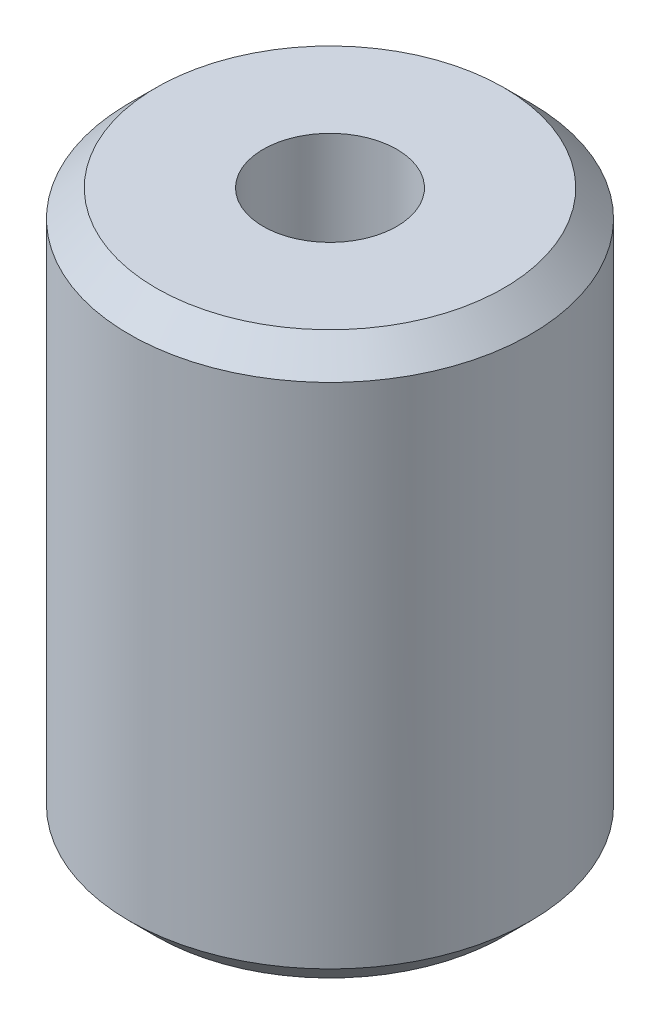
ISO-10303-21;
HEADER;
FILE_DESCRIPTION(('STEP AP214'),'2;1');
FILE_NAME('part.step','',(''),(''),'','','');
FILE_SCHEMA(('AUTOMOTIVE_DESIGN { 1 0 10303 214 1 1 1 1 }'));
ENDSEC;
DATA;
#1=APPLICATION_CONTEXT('core data for automotive mechanical design processes');
#2=APPLICATION_PROTOCOL_DEFINITION('international standard','automotive_design',2000,#1);
#3=PRODUCT_CONTEXT('',#1,'mechanical');
#4=PRODUCT('Part','Part','',(#3));
#5=PRODUCT_RELATED_PRODUCT_CATEGORY('part','',(#4));
#6=PRODUCT_DEFINITION_FORMATION('','',#4);
#7=PRODUCT_DEFINITION_CONTEXT('part definition',#1,'design');
#8=PRODUCT_DEFINITION('design','',#6,#7);
#9=PRODUCT_DEFINITION_SHAPE('','',#8);
#10=(LENGTH_UNIT() NAMED_UNIT(*) SI_UNIT(.MILLI.,.METRE.));
#11=(NAMED_UNIT(*) PLANE_ANGLE_UNIT() SI_UNIT($,.RADIAN.));
#12=(NAMED_UNIT(*) SI_UNIT($,.STERADIAN.) SOLID_ANGLE_UNIT());
#13=UNCERTAINTY_MEASURE_WITH_UNIT(LENGTH_MEASURE(1.E-05),#10,'distance_accuracy_value','');
#14=(GEOMETRIC_REPRESENTATION_CONTEXT(3) GLOBAL_UNCERTAINTY_ASSIGNED_CONTEXT((#13)) GLOBAL_UNIT_ASSIGNED_CONTEXT((#10,
#11,#12)) REPRESENTATION_CONTEXT('',''));
#15=CARTESIAN_POINT('',(0.,0.,0.));
#16=DIRECTION('',(0.,0.,1.));
#17=DIRECTION('',(1.,0.,0.));
#18=AXIS2_PLACEMENT_3D('',#15,#16,#17);
#19=CARTESIAN_POINT('',(0.,10.5,0.));
#20=DIRECTION('',(0.,1.,0.));
#21=DIRECTION('',(0.,0.,1.));
#22=AXIS2_PLACEMENT_3D('',#19,#20,#21);
#23=PLANE('',#22);
#24=CARTESIAN_POINT('',(0.,10.5,0.));
#25=DIRECTION('',(0.,1.,0.));
#26=DIRECTION('',(0.,0.,1.));
#27=AXIS2_PLACEMENT_3D('',#24,#25,#26);
#28=CIRCLE('',#27,6.50000000000002);
#29=CARTESIAN_POINT('',(0.,10.5,6.50000000000002));
#30=VERTEX_POINT('',#29);
#31=EDGE_CURVE('E10',#30,#30,#28,.T.);
#32=ORIENTED_EDGE('',*,*,#31,.T.);
#33=EDGE_LOOP('',(#32));
#34=FACE_BOUND('',#33,.T.);
#35=CARTESIAN_POINT('',(0.,10.5,0.));
#36=DIRECTION('',(0.,1.,0.));
#37=DIRECTION('',(0.,0.,1.));
#38=AXIS2_PLACEMENT_3D('',#35,#36,#37);
#39=CIRCLE('',#38,2.5);
#40=CARTESIAN_POINT('',(0.,10.5,-2.5));
#41=VERTEX_POINT('',#40);
#42=EDGE_CURVE('E60',#41,#41,#39,.T.);
#43=ORIENTED_EDGE('',*,*,#42,.F.);
#44=EDGE_LOOP('',(#43));
#45=FACE_BOUND('',#44,.T.);
#46=ADVANCED_FACE('F39',(#34,#45),#23,.T.);
#47=CARTESIAN_POINT('',(0.,-10.5,0.));
#48=DIRECTION('',(0.,1.,0.));
#49=DIRECTION('',(0.,0.,1.));
#50=AXIS2_PLACEMENT_3D('',#47,#48,#49);
#51=PLANE('',#50);
#52=CARTESIAN_POINT('',(0.,-10.5,0.));
#53=DIRECTION('',(0.,1.,0.));
#54=DIRECTION('',(0.,0.,1.));
#55=AXIS2_PLACEMENT_3D('',#52,#53,#54);
#56=CIRCLE('',#55,6.49999999999997);
#57=CARTESIAN_POINT('',(0.,-10.5,6.49999999999997));
#58=VERTEX_POINT('',#57);
#59=EDGE_CURVE('E47',#58,#58,#56,.F.);
#60=ORIENTED_EDGE('',*,*,#59,.T.);
#61=EDGE_LOOP('',(#60));
#62=FACE_BOUND('',#61,.T.);
#63=CARTESIAN_POINT('',(0.,-10.5,0.));
#64=DIRECTION('',(0.,1.,0.));
#65=DIRECTION('',(0.,0.,1.));
#66=AXIS2_PLACEMENT_3D('',#63,#64,#65);
#67=CIRCLE('',#66,2.5);
#68=CARTESIAN_POINT('',(0.,-10.5,-2.5));
#69=VERTEX_POINT('',#68);
#70=EDGE_CURVE('E61',#69,#69,#67,.T.);
#71=ORIENTED_EDGE('',*,*,#70,.T.);
#72=EDGE_LOOP('',(#71));
#73=FACE_BOUND('',#72,.T.);
#74=ADVANCED_FACE('F71',(#62,#73),#51,.F.);
#75=CARTESIAN_POINT('',(0.,10.5,0.));
#76=DIRECTION('',(0.,-1.,0.));
#77=DIRECTION('',(0.,0.,-1.));
#78=AXIS2_PLACEMENT_3D('',#75,#76,#77);
#79=CYLINDRICAL_SURFACE('',#78,7.5);
#80=CARTESIAN_POINT('',(0.,-9.49999999999998,0.));
#81=DIRECTION('',(0.,1.,0.));
#82=DIRECTION('',(0.,0.,1.));
#83=AXIS2_PLACEMENT_3D('',#80,#81,#82);
#84=CIRCLE('',#83,7.5);
#85=CARTESIAN_POINT('',(0.,-9.49999999999998,-7.5));
#86=VERTEX_POINT('',#85);
#87=EDGE_CURVE('E51',#86,#86,#84,.T.);
#88=CARTESIAN_POINT('',(0.,9.50000000000001,0.));
#89=DIRECTION('',(0.,1.,0.));
#90=DIRECTION('',(0.,0.,1.));
#91=AXIS2_PLACEMENT_3D('',#88,#89,#90);
#92=CIRCLE('',#91,7.5);
#93=CARTESIAN_POINT('',(0.,9.50000000000001,-7.5));
#94=VERTEX_POINT('',#93);
#95=EDGE_CURVE('E55',#94,#94,#92,.F.);
#96=CARTESIAN_POINT('',(0.,-9.49999999999998,-7.5));
#97=CARTESIAN_POINT('',(0.,-9.30208333333331,-7.5));
#98=CARTESIAN_POINT('',(0.,-9.10416666666665,-7.5));
#99=CARTESIAN_POINT('',(0.,-8.70833333333331,-7.5));
#100=CARTESIAN_POINT('',(0.,-8.51041666666664,-7.5));
#101=CARTESIAN_POINT('',(0.,-8.11458333333331,-7.5));
#102=CARTESIAN_POINT('',(0.,-7.91666666666665,-7.5));
#103=CARTESIAN_POINT('',(0.,-7.52083333333331,-7.5));
#104=CARTESIAN_POINT('',(0.,-7.32291666666665,-7.5));
#105=CARTESIAN_POINT('',(0.,-6.92708333333331,-7.5));
#106=CARTESIAN_POINT('',(0.,-6.72916666666665,-7.5));
#107=CARTESIAN_POINT('',(0.,-6.33333333333331,-7.5));
#108=CARTESIAN_POINT('',(0.,-6.13541666666665,-7.5));
#109=CARTESIAN_POINT('',(0.,-5.73958333333331,-7.5));
#110=CARTESIAN_POINT('',(0.,-5.54166666666665,-7.5));
#111=CARTESIAN_POINT('',(0.,-5.14583333333331,-7.5));
#112=CARTESIAN_POINT('',(0.,-4.94791666666665,-7.5));
#113=CARTESIAN_POINT('',(0.,-4.55208333333332,-7.5));
#114=CARTESIAN_POINT('',(0.,-4.35416666666665,-7.5));
#115=CARTESIAN_POINT('',(0.,-3.95833333333332,-7.5));
#116=CARTESIAN_POINT('',(0.,-3.76041666666665,-7.5));
#117=CARTESIAN_POINT('',(0.,-3.36458333333332,-7.5));
#118=CARTESIAN_POINT('',(0.,-3.16666666666665,-7.5));
#119=CARTESIAN_POINT('',(0.,-2.77083333333331,-7.5));
#120=CARTESIAN_POINT('',(0.,-2.57291666666665,-7.5));
#121=CARTESIAN_POINT('',(0.,-2.17708333333332,-7.5));
#122=CARTESIAN_POINT('',(0.,-1.97916666666665,-7.5));
#123=CARTESIAN_POINT('',(0.,-1.58333333333332,-7.5));
#124=CARTESIAN_POINT('',(0.,-1.38541666666665,-7.5));
#125=CARTESIAN_POINT('',(0.,-0.989583333333316,-7.5));
#126=CARTESIAN_POINT('',(0.,-0.791666666666649,-7.5));
#127=CARTESIAN_POINT('',(0.,-0.395833333333316,-7.5));
#128=CARTESIAN_POINT('',(0.,-0.197916666666649,-7.5));
#129=CARTESIAN_POINT('',(0.,0.197916666666684,-7.5));
#130=CARTESIAN_POINT('',(0.,0.395833333333351,-7.5));
#131=CARTESIAN_POINT('',(0.,0.791666666666684,-7.5));
#132=CARTESIAN_POINT('',(0.,0.98958333333335,-7.5));
#133=CARTESIAN_POINT('',(0.,1.38541666666668,-7.5));
#134=CARTESIAN_POINT('',(0.,1.58333333333335,-7.5));
#135=CARTESIAN_POINT('',(0.,1.97916666666668,-7.5));
#136=CARTESIAN_POINT('',(0.,2.17708333333335,-7.5));
#137=CARTESIAN_POINT('',(0.,2.57291666666668,-7.5));
#138=CARTESIAN_POINT('',(0.,2.77083333333335,-7.5));
#139=CARTESIAN_POINT('',(0.,3.16666666666668,-7.5));
#140=CARTESIAN_POINT('',(0.,3.36458333333335,-7.5));
#141=CARTESIAN_POINT('',(0.,3.76041666666668,-7.5));
#142=CARTESIAN_POINT('',(0.,3.95833333333335,-7.5));
#143=CARTESIAN_POINT('',(0.,4.35416666666668,-7.5));
#144=CARTESIAN_POINT('',(0.,4.55208333333335,-7.5));
#145=CARTESIAN_POINT('',(0.,4.94791666666668,-7.5));
#146=CARTESIAN_POINT('',(0.,5.14583333333335,-7.5));
#147=CARTESIAN_POINT('',(0.,5.54166666666668,-7.5));
#148=CARTESIAN_POINT('',(0.,5.73958333333335,-7.5));
#149=CARTESIAN_POINT('',(0.,6.13541666666668,-7.5));
#150=CARTESIAN_POINT('',(0.,6.33333333333335,-7.5));
#151=CARTESIAN_POINT('',(0.,6.72916666666668,-7.5));
#152=CARTESIAN_POINT('',(0.,6.92708333333335,-7.5));
#153=CARTESIAN_POINT('',(0.,7.32291666666668,-7.5));
#154=CARTESIAN_POINT('',(0.,7.52083333333335,-7.5));
#155=CARTESIAN_POINT('',(0.,7.91666666666668,-7.5));
#156=CARTESIAN_POINT('',(0.,8.11458333333335,-7.5));
#157=CARTESIAN_POINT('',(0.,8.51041666666668,-7.5));
#158=CARTESIAN_POINT('',(0.,8.70833333333335,-7.5));
#159=CARTESIAN_POINT('',(0.,9.10416666666668,-7.5));
#160=CARTESIAN_POINT('',(0.,9.30208333333335,-7.5));
#161=CARTESIAN_POINT('',(0.,9.50000000000001,-7.5));
#162=B_SPLINE_CURVE_WITH_KNOTS('',3,(#96,#97,#98,#99,#100,#101,#102,#103,#104,#105,#106,#107,
#108,#109,#110,#111,#112,#113,#114,#115,#116,#117,#118,#119,#120,#121,#122,#123,#124,#125,#126,
#127,#128,#129,#130,#131,#132,#133,#134,#135,#136,#137,#138,#139,#140,#141,#142,#143,#144,#145,
#146,#147,#148,#149,#150,#151,#152,#153,#154,#155,#156,#157,#158,#159,#160,#161),.UNSPECIFIED.,
.F.,.F.,(4,2,2,2,2,2,2,2,2,2,2,2,2,2,2,2,2,2,2,2,2,2,2,2,2,2,2,2,2,2,2,2,4),(0.,
0.593750000000001,1.1875,1.78125,2.375,2.96875,3.5625,4.15625,4.75,5.34375,5.9375,6.53125,7.125,
7.71875,8.3125,8.90625,9.5,10.09375,10.6875,11.28125,11.875,12.46875,13.0625,13.65625,14.25,
14.84375,15.4375,16.03125,16.625,17.21875,17.8125,18.40625,19.),.UNSPECIFIED.);
#163=EDGE_CURVE('BSEAM76',#86,#94,#162,.T.);
#164=ORIENTED_EDGE('',*,*,#87,.T.);
#165=ORIENTED_EDGE('',*,*,#95,.T.);
#166=ORIENTED_EDGE('',*,*,#163,.T.);
#167=ORIENTED_EDGE('',*,*,#163,.F.);
#168=EDGE_LOOP('',(#164,#166,#165,#167));
#169=FACE_BOUND('',#168,.T.);
#170=ADVANCED_FACE('F76',(#169),#79,.T.);
#171=CARTESIAN_POINT('',(0.,10.5,0.));
#172=DIRECTION('',(0.,-1.,0.));
#173=DIRECTION('',(0.,0.,-1.));
#174=AXIS2_PLACEMENT_3D('',#171,#172,#173);
#175=CYLINDRICAL_SURFACE('',#174,2.5);
#176=CARTESIAN_POINT('',(0.,10.5,-2.5));
#177=CARTESIAN_POINT('',(0.,10.28125,-2.5));
#178=CARTESIAN_POINT('',(0.,10.0625,-2.5));
#179=CARTESIAN_POINT('',(0.,9.625,-2.5));
#180=CARTESIAN_POINT('',(0.,9.40625,-2.5));
#181=CARTESIAN_POINT('',(0.,8.96875,-2.5));
#182=CARTESIAN_POINT('',(0.,8.75,-2.5));
#183=CARTESIAN_POINT('',(0.,8.3125,-2.5));
#184=CARTESIAN_POINT('',(0.,8.09375,-2.5));
#185=CARTESIAN_POINT('',(0.,7.65625,-2.5));
#186=CARTESIAN_POINT('',(0.,7.4375,-2.5));
#187=CARTESIAN_POINT('',(0.,7.,-2.5));
#188=CARTESIAN_POINT('',(0.,6.78125,-2.5));
#189=CARTESIAN_POINT('',(0.,6.34375,-2.5));
#190=CARTESIAN_POINT('',(0.,6.125,-2.5));
#191=CARTESIAN_POINT('',(0.,5.6875,-2.5));
#192=CARTESIAN_POINT('',(0.,5.46875,-2.5));
#193=CARTESIAN_POINT('',(0.,5.03125,-2.5));
#194=CARTESIAN_POINT('',(0.,4.8125,-2.5));
#195=CARTESIAN_POINT('',(0.,4.375,-2.5));
#196=CARTESIAN_POINT('',(0.,4.15625,-2.5));
#197=CARTESIAN_POINT('',(0.,3.71875,-2.5));
#198=CARTESIAN_POINT('',(0.,3.5,-2.5));
#199=CARTESIAN_POINT('',(0.,3.0625,-2.5));
#200=CARTESIAN_POINT('',(0.,2.84375,-2.5));
#201=CARTESIAN_POINT('',(0.,2.40625,-2.5));
#202=CARTESIAN_POINT('',(0.,2.1875,-2.5));
#203=CARTESIAN_POINT('',(0.,1.75,-2.5));
#204=CARTESIAN_POINT('',(0.,1.53125,-2.5));
#205=CARTESIAN_POINT('',(0.,1.09375,-2.5));
#206=CARTESIAN_POINT('',(0.,0.875000000000001,-2.5));
#207=CARTESIAN_POINT('',(0.,0.4375,-2.5));
#208=CARTESIAN_POINT('',(0.,0.21875,-2.5));
#209=CARTESIAN_POINT('',(0.,-0.21875,-2.5));
#210=CARTESIAN_POINT('',(0.,-0.4375,-2.5));
#211=CARTESIAN_POINT('',(0.,-0.875000000000001,-2.5));
#212=CARTESIAN_POINT('',(0.,-1.09375,-2.5));
#213=CARTESIAN_POINT('',(0.,-1.53125,-2.5));
#214=CARTESIAN_POINT('',(0.,-1.75,-2.5));
#215=CARTESIAN_POINT('',(0.,-2.1875,-2.5));
#216=CARTESIAN_POINT('',(0.,-2.40625,-2.5));
#217=CARTESIAN_POINT('',(0.,-2.84375,-2.5));
#218=CARTESIAN_POINT('',(0.,-3.0625,-2.5));
#219=CARTESIAN_POINT('',(0.,-3.5,-2.5));
#220=CARTESIAN_POINT('',(0.,-3.71875,-2.5));
#221=CARTESIAN_POINT('',(0.,-4.15625,-2.5));
#222=CARTESIAN_POINT('',(0.,-4.375,-2.5));
#223=CARTESIAN_POINT('',(0.,-4.8125,-2.5));
#224=CARTESIAN_POINT('',(0.,-5.03125,-2.5));
#225=CARTESIAN_POINT('',(0.,-5.46875,-2.5));
#226=CARTESIAN_POINT('',(0.,-5.6875,-2.5));
#227=CARTESIAN_POINT('',(0.,-6.125,-2.5));
#228=CARTESIAN_POINT('',(0.,-6.34375,-2.5));
#229=CARTESIAN_POINT('',(0.,-6.78125,-2.5));
#230=CARTESIAN_POINT('',(0.,-7.,-2.5));
#231=CARTESIAN_POINT('',(0.,-7.4375,-2.5));
#232=CARTESIAN_POINT('',(0.,-7.65625,-2.5));
#233=CARTESIAN_POINT('',(0.,-8.09375,-2.5));
#234=CARTESIAN_POINT('',(0.,-8.3125,-2.5));
#235=CARTESIAN_POINT('',(0.,-8.75,-2.5));
#236=CARTESIAN_POINT('',(0.,-8.96875,-2.5));
#237=CARTESIAN_POINT('',(0.,-9.40625,-2.5));
#238=CARTESIAN_POINT('',(0.,-9.625,-2.5));
#239=CARTESIAN_POINT('',(0.,-10.0625,-2.5));
#240=CARTESIAN_POINT('',(0.,-10.28125,-2.5));
#241=CARTESIAN_POINT('',(0.,-10.5,-2.5));
#242=B_SPLINE_CURVE_WITH_KNOTS('',3,(#176,#177,#178,#179,#180,#181,#182,#183,#184,#185,#186,
#187,#188,#189,#190,#191,#192,#193,#194,#195,#196,#197,#198,#199,#200,#201,#202,#203,#204,#205,
#206,#207,#208,#209,#210,#211,#212,#213,#214,#215,#216,#217,#218,#219,#220,#221,#222,#223,#224,
#225,#226,#227,#228,#229,#230,#231,#232,#233,#234,#235,#236,#237,#238,#239,#240,#241),
.UNSPECIFIED.,.F.,.F.,(4,2,2,2,2,2,2,2,2,2,2,2,2,2,2,2,2,2,2,2,2,2,2,2,2,2,2,2,2,2,2,2,4),(0.,
0.656250000000001,1.3125,1.96875,2.625,3.28125,3.9375,4.59375,5.25,5.90625,6.5625,7.21875,7.875,
8.53125,9.1875,9.84375,10.5,11.15625,11.8125,12.46875,13.125,13.78125,14.4375,15.09375,15.75,
16.40625,17.0625,17.71875,18.375,19.03125,19.6875,20.34375,21.),.UNSPECIFIED.);
#243=EDGE_CURVE('BSEAM67',#41,#69,#242,.T.);
#244=ORIENTED_EDGE('',*,*,#42,.T.);
#245=ORIENTED_EDGE('',*,*,#70,.F.);
#246=ORIENTED_EDGE('',*,*,#243,.T.);
#247=ORIENTED_EDGE('',*,*,#243,.F.);
#248=EDGE_LOOP('',(#244,#246,#245,#247));
#249=FACE_BOUND('',#248,.T.);
#250=ADVANCED_FACE('F67',(#249),#175,.F.);
#251=CARTESIAN_POINT('',(0.,-9.49999999999998,0.));
#252=DIRECTION('',(0.,1.,0.));
#253=DIRECTION('',(0.,0.,1.));
#254=AXIS2_PLACEMENT_3D('',#251,#252,#253);
#255=CONICAL_SURFACE('',#254,7.5,0.78539816339745);
#256=ORIENTED_EDGE('',*,*,#59,.F.);
#257=EDGE_LOOP('',(#256));
#258=FACE_BOUND('',#257,.T.);
#259=ORIENTED_EDGE('',*,*,#87,.F.);
#260=EDGE_LOOP('',(#259));
#261=FACE_BOUND('',#260,.T.);
#262=ADVANCED_FACE('F83',(#258,#261),#255,.T.);
#263=CARTESIAN_POINT('',(0.,10.5,0.));
#264=DIRECTION('',(0.,-1.,0.));
#265=DIRECTION('',(0.,0.,-1.));
#266=AXIS2_PLACEMENT_3D('',#263,#264,#265);
#267=CONICAL_SURFACE('',#266,6.50000000000002,0.785398163397446);
#268=ORIENTED_EDGE('',*,*,#95,.F.);
#269=EDGE_LOOP('',(#268));
#270=FACE_BOUND('',#269,.T.);
#271=ORIENTED_EDGE('',*,*,#31,.F.);
#272=EDGE_LOOP('',(#271));
#273=FACE_BOUND('',#272,.T.);
#274=ADVANCED_FACE('F42',(#270,#273),#267,.T.);
#275=CLOSED_SHELL('',(#46,#74,#170,#250,#262,#274));
#276=MANIFOLD_SOLID_BREP('B2',#275);
#277=ADVANCED_BREP_SHAPE_REPRESENTATION('',(#18,#276),#14);
#278=SHAPE_DEFINITION_REPRESENTATION(#9,#277);
ENDSEC;
END-ISO-10303-21;
